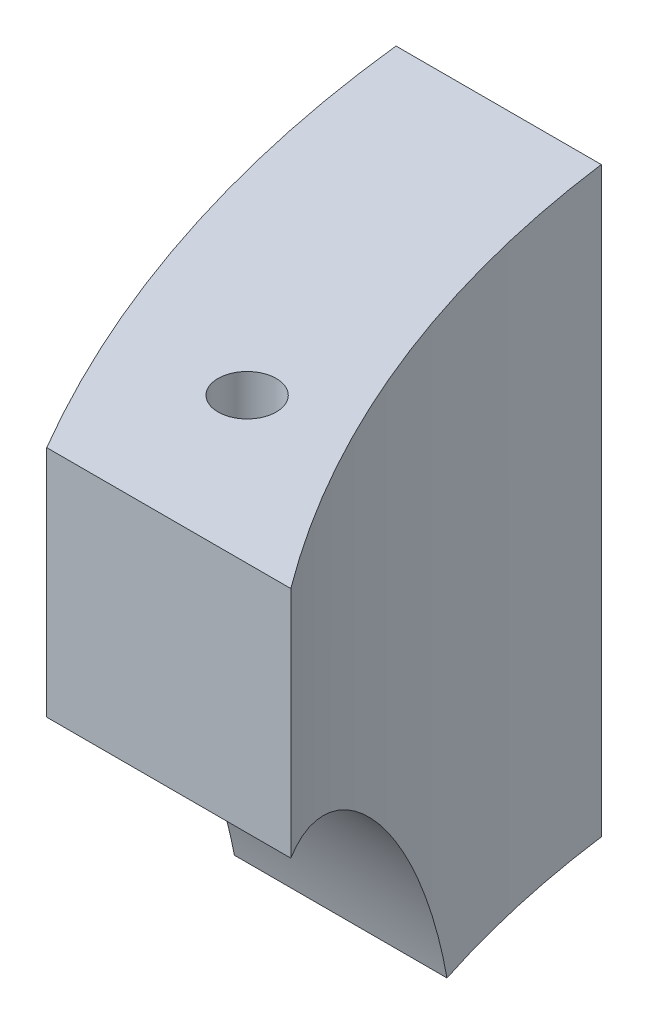
ISO-10303-21;
HEADER;
FILE_DESCRIPTION(('STEP AP214'),'2;1');
FILE_NAME('part.step','',(''),(''),'','','');
FILE_SCHEMA(('AUTOMOTIVE_DESIGN { 1 0 10303 214 1 1 1 1 }'));
ENDSEC;
DATA;
#1=APPLICATION_CONTEXT('core data for automotive mechanical design processes');
#2=APPLICATION_PROTOCOL_DEFINITION('international standard','automotive_design',2000,#1);
#3=PRODUCT_CONTEXT('',#1,'mechanical');
#4=PRODUCT('Part','Part','',(#3));
#5=PRODUCT_RELATED_PRODUCT_CATEGORY('part','',(#4));
#6=PRODUCT_DEFINITION_FORMATION('','',#4);
#7=PRODUCT_DEFINITION_CONTEXT('part definition',#1,'design');
#8=PRODUCT_DEFINITION('design','',#6,#7);
#9=PRODUCT_DEFINITION_SHAPE('','',#8);
#10=(LENGTH_UNIT() NAMED_UNIT(*) SI_UNIT(.MILLI.,.METRE.));
#11=(NAMED_UNIT(*) PLANE_ANGLE_UNIT() SI_UNIT($,.RADIAN.));
#12=(NAMED_UNIT(*) SI_UNIT($,.STERADIAN.) SOLID_ANGLE_UNIT());
#13=UNCERTAINTY_MEASURE_WITH_UNIT(LENGTH_MEASURE(1.E-05),#10,'distance_accuracy_value','');
#14=(GEOMETRIC_REPRESENTATION_CONTEXT(3) GLOBAL_UNCERTAINTY_ASSIGNED_CONTEXT((#13)) GLOBAL_UNIT_ASSIGNED_CONTEXT((#10,
#11,#12)) REPRESENTATION_CONTEXT('',''));
#15=CARTESIAN_POINT('',(0.,0.,0.));
#16=DIRECTION('',(0.,0.,1.));
#17=DIRECTION('',(1.,0.,0.));
#18=AXIS2_PLACEMENT_3D('',#15,#16,#17);
#19=CARTESIAN_POINT('',(0.,-60.,0.));
#20=DIRECTION('',(0.,1.,0.));
#21=DIRECTION('',(0.,0.,1.));
#22=AXIS2_PLACEMENT_3D('',#19,#20,#21);
#23=CYLINDRICAL_SURFACE('',#22,76.805);
#24=DIRECTION('',(0.,1.,0.));
#25=VECTOR('',#24,1.);
#26=CARTESIAN_POINT('',(-76.1512181452142,-100.,9.99999999999961));
#27=LINE('',#26,#25);
#28=CARTESIAN_POINT('',(-76.1512181452142,-100.,9.99999999999961));
#29=VERTEX_POINT('',#28);
#30=CARTESIAN_POINT('',(-76.1512181452142,-60.,9.99999999999961));
#31=VERTEX_POINT('',#30);
#32=EDGE_CURVE('E107',#29,#31,#27,.T.);
#33=ORIENTED_EDGE('',*,*,#32,.T.);
#34=CARTESIAN_POINT('',(0.,-60.,0.));
#35=DIRECTION('',(0.,-1.,0.));
#36=DIRECTION('',(0.,0.,-1.));
#37=AXIS2_PLACEMENT_3D('',#34,#35,#36);
#38=CIRCLE('',#37,76.805);
#39=CARTESIAN_POINT('',(-61.5905805028132,-60.,45.8869090081963));
#40=VERTEX_POINT('',#39);
#41=EDGE_CURVE('E88',#31,#40,#38,.F.);
#42=ORIENTED_EDGE('',*,*,#41,.T.);
#43=DIRECTION('',(0.,1.,0.));
#44=VECTOR('',#43,1.);
#45=CARTESIAN_POINT('',(-61.5905805028132,-100.,45.8869090081963));
#46=LINE('',#45,#44);
#47=CARTESIAN_POINT('',(-61.5905805028132,-76.0376066251599,45.8869090081963));
#48=VERTEX_POINT('',#47);
#49=EDGE_CURVE('E106',#48,#40,#46,.T.);
#50=ORIENTED_EDGE('',*,*,#49,.F.);
#51=CARTESIAN_POINT('',(-61.5905805028132,-76.0376066251599,45.8869090081963));
#52=CARTESIAN_POINT('',(-61.8724879759073,-76.1615804574404,45.508541010111));
#53=CARTESIAN_POINT('',(-62.1496833209392,-76.2933266038598,45.1291894544505));
#54=CARTESIAN_POINT('',(-62.6943847469691,-76.5728008223829,44.3693623114229));
#55=CARTESIAN_POINT('',(-62.9618898947462,-76.7205304283509,43.9888866195914));
#56=CARTESIAN_POINT('',(-63.4870614976273,-77.0324861006369,43.2274810640035));
#57=CARTESIAN_POINT('',(-63.7447214748006,-77.1967227788302,42.8465510656696));
#58=CARTESIAN_POINT('',(-64.2497301445695,-77.5419306381188,42.0854950338412));
#59=CARTESIAN_POINT('',(-64.4970791274666,-77.7229013476125,41.7053689779986));
#60=CARTESIAN_POINT('',(-65.2241351289306,-78.2920296701556,40.5663838739214));
#61=CARTESIAN_POINT('',(-65.6880671570044,-78.705940658175,39.8100582990234));
#62=CARTESIAN_POINT('',(-66.5720205057861,-79.6033606792859,38.3135700821961));
#63=CARTESIAN_POINT('',(-66.9920523591591,-80.0868529517458,37.5734035971985));
#64=CARTESIAN_POINT('',(-67.789457330275,-81.1257387039277,36.1149724125224));
#65=CARTESIAN_POINT('',(-68.1666320639874,-81.6814429119866,35.3968199772308));
#66=CARTESIAN_POINT('',(-68.8762432177263,-82.8614384512383,33.9954161489857));
#67=CARTESIAN_POINT('',(-69.2086751187448,-83.4857366988525,33.3121682856973));
#68=CARTESIAN_POINT('',(-69.829301277256,-84.7989121619739,31.9907659512638));
#69=CARTESIAN_POINT('',(-70.1175475464876,-85.4877118881778,31.3525589469111));
#70=CARTESIAN_POINT('',(-70.6518906952164,-86.9259293828332,30.1291241565394));
#71=CARTESIAN_POINT('',(-70.8979927127415,-87.6753397454977,29.5438899164388));
#72=CARTESIAN_POINT('',(-71.33366024115,-89.1719885659438,28.4749941344923));
#73=CARTESIAN_POINT('',(-71.5260516137345,-89.915338511502,27.9870286320866));
#74=CARTESIAN_POINT('',(-71.8786494685781,-91.4441654789608,27.0686141988077));
#75=CARTESIAN_POINT('',(-72.0388524348975,-92.2296470910442,26.6381715528745));
#76=CARTESIAN_POINT('',(-72.3289722770888,-93.8358756386956,25.8400457182096));
#77=CARTESIAN_POINT('',(-72.4589280853882,-94.6565756126157,25.4722820178698));
#78=CARTESIAN_POINT('',(-72.6908265875386,-96.3278865694105,24.8027696314158));
#79=CARTESIAN_POINT('',(-72.7927857121498,-97.1784796764486,24.5009822462556));
#80=CARTESIAN_POINT('',(-72.9150335177527,-98.3644406386399,24.1333160888137));
#81=CARTESIAN_POINT('',(-72.9465528429963,-98.6897337640126,24.0378356742379));
#82=CARTESIAN_POINT('',(-73.0059576790096,-99.3428916675791,23.8568067477289));
#83=CARTESIAN_POINT('',(-73.0338483671424,-99.6707520581313,23.77124410451));
#84=CARTESIAN_POINT('',(-73.0599944407869,-100.,23.690614962727));
#85=B_SPLINE_CURVE_WITH_KNOTS('',3,(#51,#52,#53,#54,#55,#56,#57,#58,#59,#60,#61,#62,#63,#64,#65,
#66,#67,#68,#69,#70,#71,#72,#73,#74,#75,#76,#77,#78,#79,#80,#81,#82,#83,#84),.UNSPECIFIED.,.F.,
.F.,(4,2,2,2,2,2,2,2,2,2,2,2,2,2,2,2,4),(0.,1.46350327731127,2.92714712556941,4.39173799686065,
5.85628760534677,8.78975158938339,11.7225101442121,14.668334326783,17.614455813495,
20.5570822853487,23.4993497503075,26.2253702261823,28.9516883036157,31.6744775693344,
34.3956654459655,35.4169674751842,36.4367959385946),.UNSPECIFIED.);
#86=CARTESIAN_POINT('',(-73.0599944407868,-100.,23.690614962727));
#87=VERTEX_POINT('',#86);
#88=EDGE_CURVE('E124',#48,#87,#85,.T.);
#89=ORIENTED_EDGE('',*,*,#88,.T.);
#90=CARTESIAN_POINT('',(2.08166817117217E-12,-100.,-8.46545056276682E-13));
#91=DIRECTION('',(0.,1.,0.));
#92=DIRECTION('',(0.,0.,1.));
#93=AXIS2_PLACEMENT_3D('',#90,#91,#92);
#94=CIRCLE('',#93,76.8050000000022);
#95=EDGE_CURVE('E93',#29,#87,#94,.T.);
#96=ORIENTED_EDGE('',*,*,#95,.F.);
#97=EDGE_LOOP('',(#33,#42,#50,#89,#96));
#98=FACE_BOUND('',#97,.T.);
#99=ADVANCED_FACE('F34',(#98),#23,.F.);
#100=CARTESIAN_POINT('',(0.,-60.,0.));
#101=DIRECTION('',(0.,1.,0.));
#102=DIRECTION('',(0.,0.,1.));
#103=AXIS2_PLACEMENT_3D('',#100,#101,#102);
#104=CYLINDRICAL_SURFACE('',#103,90.805);
#105=CARTESIAN_POINT('',(0.,-60.,0.));
#106=DIRECTION('',(0.,-1.,0.));
#107=DIRECTION('',(0.,0.,-1.));
#108=AXIS2_PLACEMENT_3D('',#105,#106,#107);
#109=CIRCLE('',#108,90.805);
#110=CARTESIAN_POINT('',(-90.252689849112,-60.,9.99999999999961));
#111=VERTEX_POINT('',#110);
#112=CARTESIAN_POINT('',(-78.3577667284712,-60.,45.8869090081963));
#113=VERTEX_POINT('',#112);
#114=EDGE_CURVE('E54',#111,#113,#109,.F.);
#115=ORIENTED_EDGE('',*,*,#114,.F.);
#116=DIRECTION('',(0.,1.,0.));
#117=VECTOR('',#116,1.);
#118=CARTESIAN_POINT('',(-90.252689849112,-100.,9.99999999999961));
#119=LINE('',#118,#117);
#120=CARTESIAN_POINT('',(-90.252689849112,-100.,9.99999999999961));
#121=VERTEX_POINT('',#120);
#122=EDGE_CURVE('E101',#121,#111,#119,.T.);
#123=ORIENTED_EDGE('',*,*,#122,.F.);
#124=CARTESIAN_POINT('',(2.26207941267376E-12,-100.,-8.74300631892311E-13));
#125=DIRECTION('',(0.,-1.,0.));
#126=DIRECTION('',(0.,0.,1.));
#127=AXIS2_PLACEMENT_3D('',#124,#125,#126);
#128=CIRCLE('',#127,90.8050000000023);
#129=CARTESIAN_POINT('',(-87.6601550745138,-100.,23.690614962727));
#130=VERTEX_POINT('',#129);
#131=EDGE_CURVE('E116',#130,#121,#128,.T.);
#132=ORIENTED_EDGE('',*,*,#131,.F.);
#133=CARTESIAN_POINT('',(-78.3577667284712,-76.0376066251599,45.8869090081963));
#134=CARTESIAN_POINT('',(-78.5924473159575,-76.1689068918217,45.4861771932687));
#135=CARTESIAN_POINT('',(-78.8228617009509,-76.3084983273187,45.0856503262618));
#136=CARTESIAN_POINT('',(-79.2749753014099,-76.6045032034185,44.2858553963328));
#137=CARTESIAN_POINT('',(-79.4966738682963,-76.7609178926845,43.8865874291163));
#138=CARTESIAN_POINT('',(-79.93123879399,-77.0908659244213,43.090034511724));
#139=CARTESIAN_POINT('',(-80.1441010131283,-77.2644071646159,42.6927505660127));
#140=CARTESIAN_POINT('',(-80.5606987495879,-77.628669644403,41.9013357120492));
#141=CARTESIAN_POINT('',(-80.7644344711998,-77.8193904991533,41.5072047333823));
#142=CARTESIAN_POINT('',(-81.3620238071811,-78.417776377688,40.3304179202884));
#143=CARTESIAN_POINT('',(-81.7420516661545,-78.8515073193961,39.5537506263202));
#144=CARTESIAN_POINT('',(-82.4642522133015,-79.7879903483694,38.0251245028361));
#145=CARTESIAN_POINT('',(-82.8064317795716,-80.2907298575056,37.2731612014305));
#146=CARTESIAN_POINT('',(-83.4541133476261,-81.3657172459826,35.7995644949122));
#147=CARTESIAN_POINT('',(-83.7594916971807,-81.9381871401374,35.0780383614937));
#148=CARTESIAN_POINT('',(-84.3328822717363,-83.1487224762524,33.6762045151858));
#149=CARTESIAN_POINT('',(-84.6008914114346,-83.7867933268575,32.9959002083003));
#150=CARTESIAN_POINT('',(-85.100587098163,-85.1243076507707,31.6848565251361));
#151=CARTESIAN_POINT('',(-85.332294366709,-85.8237157538185,31.0540889760324));
#152=CARTESIAN_POINT('',(-85.7612529753876,-87.2793457600486,29.849032109615));
#153=CARTESIAN_POINT('',(-85.9585077567818,-88.0355619781904,29.2747371540841));
#154=CARTESIAN_POINT('',(-86.3112785847532,-89.5587862752785,28.2171202605891));
#155=CARTESIAN_POINT('',(-86.4684233816406,-90.3232230496112,27.7306328623269));
#156=CARTESIAN_POINT('',(-86.7555037061851,-91.8928780923187,26.8190067726851));
#157=CARTESIAN_POINT('',(-86.8854355435854,-92.6981018733181,26.3938764041501));
#158=CARTESIAN_POINT('',(-87.1197567652052,-94.3419724243445,25.609826826792));
#159=CARTESIAN_POINT('',(-87.2241889062247,-95.1805604656519,25.2507970355623));
#160=CARTESIAN_POINT('',(-87.409530876033,-96.886051907719,24.601545085342));
#161=CARTESIAN_POINT('',(-87.4904556042024,-97.7529369840286,24.3112793641834));
#162=CARTESIAN_POINT('',(-87.5784852800884,-98.8576137884529,23.9908628374244));
#163=CARTESIAN_POINT('',(-87.5958350107837,-99.0852687247497,23.9274253555937));
#164=CARTESIAN_POINT('',(-87.6290759757658,-99.5417308559339,23.8054005587297));
#165=CARTESIAN_POINT('',(-87.6449686783639,-99.7705366401469,23.7468083668533));
#166=CARTESIAN_POINT('',(-87.6601550745138,-100.,23.690614962727));
#167=B_SPLINE_CURVE_WITH_KNOTS('',3,(#133,#134,#135,#136,#137,#138,#139,#140,#141,#142,#143,
#144,#145,#146,#147,#148,#149,#150,#151,#152,#153,#154,#155,#156,#157,#158,#159,#160,#161,#162,
#163,#164,#165,#166),.UNSPECIFIED.,.F.,.F.,(4,2,2,2,2,2,2,2,2,2,2,2,2,2,2,2,4),(0.,
1.447717955692,2.89554343881256,4.34403971873127,5.79250355880858,8.69081564008807,
11.5886001483948,14.4958647087084,17.4033691586731,20.3092078777708,23.2147561830751,
25.9703463563231,28.7263099641602,31.4776202583256,34.2271829032457,34.9380419918491,
35.6481766556987),.UNSPECIFIED.);
#168=CARTESIAN_POINT('',(-78.3577667284712,-76.0376066251599,45.8869090081963));
#169=VERTEX_POINT('',#168);
#170=EDGE_CURVE('E62',#169,#130,#167,.T.);
#171=ORIENTED_EDGE('',*,*,#170,.F.);
#172=DIRECTION('',(0.,1.,0.));
#173=VECTOR('',#172,1.);
#174=CARTESIAN_POINT('',(-78.3577667284712,-60.,45.8869090081963));
#175=LINE('',#174,#173);
#176=EDGE_CURVE('E94',#169,#113,#175,.T.);
#177=ORIENTED_EDGE('',*,*,#176,.T.);
#178=EDGE_LOOP('',(#115,#123,#132,#171,#177));
#179=FACE_BOUND('',#178,.T.);
#180=ADVANCED_FACE('F99',(#179),#104,.T.);
#181=CARTESIAN_POINT('',(-90.252689849112,-100.,9.99999999999961));
#182=DIRECTION('',(0.,0.,1.));
#183=DIRECTION('',(1.,0.,0.));
#184=AXIS2_PLACEMENT_3D('',#181,#182,#183);
#185=PLANE('',#184);
#186=CARTESIAN_POINT('',(-82.252689849112,-87.5,9.99999999999961));
#187=DIRECTION('',(0.,0.,-1.));
#188=DIRECTION('',(-1.,0.,0.));
#189=AXIS2_PLACEMENT_3D('',#186,#187,#188);
#190=CIRCLE('',#189,2.);
#191=CARTESIAN_POINT('',(-84.252689849112,-87.5,9.99999999999961));
#192=VERTEX_POINT('',#191);
#193=EDGE_CURVE('E156',#192,#192,#190,.T.);
#194=ORIENTED_EDGE('',*,*,#193,.F.);
#195=EDGE_LOOP('',(#194));
#196=FACE_BOUND('',#195,.T.);
#197=DIRECTION('',(1.,0.,0.));
#198=VECTOR('',#197,1.);
#199=CARTESIAN_POINT('',(-90.252689849112,-60.,9.99999999999961));
#200=LINE('',#199,#198);
#201=EDGE_CURVE('E85',#111,#31,#200,.T.);
#202=ORIENTED_EDGE('',*,*,#201,.T.);
#203=ORIENTED_EDGE('',*,*,#32,.F.);
#204=DIRECTION('',(1.,0.,0.));
#205=VECTOR('',#204,1.);
#206=CARTESIAN_POINT('',(-90.252689849112,-100.,9.99999999999961));
#207=LINE('',#206,#205);
#208=EDGE_CURVE('E105',#121,#29,#207,.T.);
#209=ORIENTED_EDGE('',*,*,#208,.F.);
#210=ORIENTED_EDGE('',*,*,#122,.T.);
#211=EDGE_LOOP('',(#202,#203,#209,#210));
#212=FACE_BOUND('',#211,.T.);
#213=ADVANCED_FACE('F104',(#196,#212),#185,.F.);
#214=CARTESIAN_POINT('',(2.08166817117217E-12,-100.,-8.46545056276682E-13));
#215=DIRECTION('',(0.,1.,0.));
#216=DIRECTION('',(0.,0.,1.));
#217=AXIS2_PLACEMENT_3D('',#214,#215,#216);
#218=PLANE('',#217);
#219=ORIENTED_EDGE('',*,*,#95,.T.);
#220=DIRECTION('',(1.,0.,0.));
#221=VECTOR('',#220,1.);
#222=CARTESIAN_POINT('',(-90.,-100.,23.690614962727));
#223=LINE('',#222,#221);
#224=EDGE_CURVE('E48',#87,#130,#223,.F.);
#225=ORIENTED_EDGE('',*,*,#224,.T.);
#226=ORIENTED_EDGE('',*,*,#131,.T.);
#227=ORIENTED_EDGE('',*,*,#208,.T.);
#228=EDGE_LOOP('',(#219,#225,#226,#227));
#229=FACE_BOUND('',#228,.T.);
#230=ADVANCED_FACE('F115',(#229),#218,.F.);
#231=CARTESIAN_POINT('',(-90.,-59.9171673050235,45.8869090081963));
#232=DIRECTION('',(0.,0.,1.));
#233=DIRECTION('',(1.,0.,0.));
#234=AXIS2_PLACEMENT_3D('',#231,#232,#233);
#235=PLANE('',#234);
#236=DIRECTION('',(1.,0.,0.));
#237=VECTOR('',#236,1.);
#238=CARTESIAN_POINT('',(-90.,-60.,45.8869090081963));
#239=LINE('',#238,#237);
#240=EDGE_CURVE('E11',#113,#40,#239,.T.);
#241=ORIENTED_EDGE('',*,*,#240,.F.);
#242=ORIENTED_EDGE('',*,*,#176,.F.);
#243=DIRECTION('',(1.,0.,0.));
#244=VECTOR('',#243,1.);
#245=CARTESIAN_POINT('',(-90.,-76.0376066251599,45.8869090081963));
#246=LINE('',#245,#244);
#247=EDGE_CURVE('E178',#169,#48,#246,.T.);
#248=ORIENTED_EDGE('',*,*,#247,.T.);
#249=ORIENTED_EDGE('',*,*,#49,.T.);
#250=EDGE_LOOP('',(#241,#242,#248,#249));
#251=FACE_BOUND('',#250,.T.);
#252=ADVANCED_FACE('F140',(#251),#235,.T.);
#253=CARTESIAN_POINT('',(-90.,-108.000167786146,56.3599898084857));
#254=DIRECTION('',(1.,0.,0.));
#255=DIRECTION('',(0.,0.,-1.));
#256=AXIS2_PLACEMENT_3D('',#253,#254,#255);
#257=CYLINDRICAL_SURFACE('',#256,33.6346657099366);
#258=CARTESIAN_POINT('',(-74.5905805028132,-79.8925883249909,37.8869090081963));
#259=CARTESIAN_POINT('',(-74.4919381024718,-79.8925876494779,37.886910057739));
#260=CARTESIAN_POINT('',(-74.3932984233326,-79.8974045752662,37.879574641305));
#261=CARTESIAN_POINT('',(-74.1990643123797,-79.9164334856359,37.8506706268829));
#262=CARTESIAN_POINT('',(-74.1034704252606,-79.930647140907,37.8290994978602));
#263=CARTESIAN_POINT('',(-73.9183169843913,-79.9677541619103,37.7730148653726));
#264=CARTESIAN_POINT('',(-73.8287395681785,-79.9906203635771,37.7385418700833));
#265=CARTESIAN_POINT('',(-73.6573104322726,-80.0441061588174,37.6583409654646));
#266=CARTESIAN_POINT('',(-73.5754603390429,-80.0747273797113,37.6126106939545));
#267=CARTESIAN_POINT('',(-73.4165492869476,-80.1445648706848,37.5089890962435));
#268=CARTESIAN_POINT('',(-73.3400086320911,-80.1841647376021,37.4505624751808));
#269=CARTESIAN_POINT('',(-73.1979504447499,-80.2695935276639,37.3255019622106));
#270=CARTESIAN_POINT('',(-73.1324370895971,-80.3154247995406,37.258864976557));
#271=CARTESIAN_POINT('',(-73.0035769258074,-80.4196251763493,37.1086529035651));
#272=CARTESIAN_POINT('',(-72.9421152203748,-80.478838332308,37.0240493492363));
#273=CARTESIAN_POINT('',(-72.8343117729956,-80.602486649225,36.8492415357029));
#274=CARTESIAN_POINT('',(-72.7879797213449,-80.6669251240664,36.7590337309129));
#275=CARTESIAN_POINT('',(-72.702990028811,-80.8118138248766,36.5584223004819));
#276=CARTESIAN_POINT('',(-72.667271019297,-80.8930415454429,36.4473347857182));
#277=CARTESIAN_POINT('',(-72.6157147225592,-81.0590686656895,36.2232717395477));
#278=CARTESIAN_POINT('',(-72.5998875683319,-81.143869863001,36.1102952755695));
#279=CARTESIAN_POINT('',(-72.5863503159674,-81.3297869800719,35.8658730511086));
#280=CARTESIAN_POINT('',(-72.5921131612187,-81.4312593584554,35.7344986572806));
#281=CARTESIAN_POINT('',(-72.629006420131,-81.6344825876318,35.4753406629648));
#282=CARTESIAN_POINT('',(-72.6601712768923,-81.7362336294591,35.3475621817619));
#283=CARTESIAN_POINT('',(-72.7513345183699,-81.9455954865533,35.0884133392869));
#284=CARTESIAN_POINT('',(-72.8135114819808,-82.0529916577668,34.9576251855252));
#285=CARTESIAN_POINT('',(-72.9679482804267,-82.2604455647596,34.7085800418953));
#286=CARTESIAN_POINT('',(-73.0601473882327,-82.3605176190106,34.5902983891212));
#287=CARTESIAN_POINT('',(-73.2375207201768,-82.5142977081177,34.4107317376554));
#288=CARTESIAN_POINT('',(-73.3138093128713,-82.5719537052931,34.3440098775041));
#289=CARTESIAN_POINT('',(-73.4793333584941,-82.6791064709874,34.2208568239338));
#290=CARTESIAN_POINT('',(-73.5685473498411,-82.7286164797888,34.1644089153078));
#291=CARTESIAN_POINT('',(-73.7415655666576,-82.8083931913032,34.0739359968611));
#292=CARTESIAN_POINT('',(-73.8233435919134,-82.8405244949932,34.0376962038673));
#293=CARTESIAN_POINT('',(-73.9938110367875,-82.8955132759761,33.9758709400627));
#294=CARTESIAN_POINT('',(-74.0824965179711,-82.9183759924722,33.9502794499284));
#295=CARTESIAN_POINT('',(-74.2652750851301,-82.9532394268613,33.9113189459625));
#296=CARTESIAN_POINT('',(-74.3594001211861,-82.9651671352841,33.8980320801966));
#297=CARTESIAN_POINT('',(-74.5493247082443,-82.9767986812711,33.8850744027406));
#298=CARTESIAN_POINT('',(-74.645123426872,-82.9765084314266,33.8853970050711));
#299=CARTESIAN_POINT('',(-74.8243875967286,-82.9644652601745,33.8988146376371));
#300=CARTESIAN_POINT('',(-74.908051779659,-82.9539751114895,33.9105026170725));
#301=CARTESIAN_POINT('',(-75.0717030254832,-82.9241296844777,33.9438450340387));
#302=CARTESIAN_POINT('',(-75.151689604634,-82.9047732435502,33.9655007786035));
#303=CARTESIAN_POINT('',(-75.3092387834228,-82.8575173548866,34.0185672274577));
#304=CARTESIAN_POINT('',(-75.3865992071851,-82.8293257802179,34.0503121246196));
#305=CARTESIAN_POINT('',(-75.5345390379904,-82.7661682245691,34.1217730837662));
#306=CARTESIAN_POINT('',(-75.6051144916032,-82.7311983293958,34.1614937518995));
#307=CARTESIAN_POINT('',(-75.7713139660186,-82.6376638387801,34.2683337073505));
#308=CARTESIAN_POINT('',(-75.8625789733266,-82.5758594408291,34.3394219144166));
#309=CARTESIAN_POINT('',(-76.0287355482759,-82.4441207474417,34.4924463870867));
#310=CARTESIAN_POINT('',(-76.1035898326017,-82.3741684814872,34.5744066890499));
#311=CARTESIAN_POINT('',(-76.2550242273526,-82.2094669689479,34.7694645993317));
#312=CARTESIAN_POINT('',(-76.3266821376625,-82.1130991589375,34.8850174916617));
#313=CARTESIAN_POINT('',(-76.4445390738922,-81.915988856915,35.1248652257935));
#314=CARTESIAN_POINT('',(-76.4907291529477,-81.8152448409297,35.2491631224515));
#315=CARTESIAN_POINT('',(-76.5581808912712,-81.6113392973282,35.5045966007249));
#316=CARTESIAN_POINT('',(-76.5791853666646,-81.5081636195361,35.6357886795123));
#317=CARTESIAN_POINT('',(-76.5949335055378,-81.3029853320338,35.9007795159136));
#318=CARTESIAN_POINT('',(-76.5896628122574,-81.2009833941687,36.0345796587973));
#319=CARTESIAN_POINT('',(-76.5505570300321,-80.9941311461536,36.3101444590365));
#320=CARTESIAN_POINT('',(-76.5148510679938,-80.8895404428865,36.4518489418498));
#321=CARTESIAN_POINT('',(-76.4107613840051,-80.6883570953563,36.7287681535069));
#322=CARTESIAN_POINT('',(-76.3424406142955,-80.5917494620227,36.8639948346688));
#323=CARTESIAN_POINT('',(-76.1981368619552,-80.438498724321,37.0815779022657));
#324=CARTESIAN_POINT('',(-76.1308491749747,-80.3786544330268,37.1674785967541));
#325=CARTESIAN_POINT('',(-75.9800707799443,-80.266664194755,37.3296668918994));
#326=CARTESIAN_POINT('',(-75.8965871650664,-80.2145148952166,37.4059586768405));
#327=CARTESIAN_POINT('',(-75.713525477295,-80.1195383208822,37.5459397164887));
#328=CARTESIAN_POINT('',(-75.6138144203857,-80.0767955928977,37.6095142382264));
#329=CARTESIAN_POINT('',(-75.4011621714334,-80.0034678175643,37.719176567376));
#330=CARTESIAN_POINT('',(-75.2882394650818,-79.9728660399485,37.7652884343651));
#331=CARTESIAN_POINT('',(-75.0779530243244,-79.9306821522558,37.8290467288362));
#332=CARTESIAN_POINT('',(-74.9823006375623,-79.9164556748531,37.8506370341123));
#333=CARTESIAN_POINT('',(-74.7879569871625,-79.8974116236296,37.8795638243515));
#334=CARTESIAN_POINT('',(-74.6892673831595,-79.8925890008085,37.8869079581803));
#335=CARTESIAN_POINT('',(-74.5905805028132,-79.8925883249909,37.8869090081963));
#336=B_SPLINE_CURVE_WITH_KNOTS('',3,(#258,#259,#260,#261,#262,#263,#264,#265,#266,#267,#268,
#269,#270,#271,#272,#273,#274,#275,#276,#277,#278,#279,#280,#281,#282,#283,#284,#285,#286,#287,
#288,#289,#290,#291,#292,#293,#294,#295,#296,#297,#298,#299,#300,#301,#302,#303,#304,#305,#306,
#307,#308,#309,#310,#311,#312,#313,#314,#315,#316,#317,#318,#319,#320,#321,#322,#323,#324,#325,
#326,#327,#328,#329,#330,#331,#332,#333,#334,#335),.UNSPECIFIED.,.T.,.F.,(4,2,2,2,2,2,2,2,2,2,2,
2,2,2,2,2,2,2,2,2,2,2,2,2,2,2,2,2,2,2,2,2,2,2,2,2,2,2,4),(0.,0.295543061906685,0.5911386839711,
0.885813901594473,1.18055100544546,1.491696702054,1.80296000205405,2.16212636321424,
2.52152231541366,2.94643351315853,3.37156107487568,3.86779375804624,4.36470041465287,
4.90285223015785,5.43992219628566,5.78855188885838,6.13660920675713,6.42060915157769,
6.7044483367266,6.99016910735621,7.2757516117817,7.52996050452445,7.784202740186,
8.04794265360891,8.31183532184535,8.70314527102876,9.09533522572514,9.59271772338167,
10.0902748406567,10.5928706552126,11.0957411183647,11.6319558994202,12.1671398520389,
12.5390625338964,12.9108226946453,13.2857989209938,13.6602566191303,13.9560918277659,
14.2517681564707),.UNSPECIFIED.);
#337=CARTESIAN_POINT('',(-74.5905805028132,-79.8925883249909,37.8869090081963));
#338=VERTEX_POINT('',#337);
#339=EDGE_CURVE('E148',#338,#338,#336,.T.);
#340=ORIENTED_EDGE('',*,*,#339,.T.);
#341=EDGE_LOOP('',(#340));
#342=FACE_BOUND('',#341,.T.);
#343=CARTESIAN_POINT('',(-84.252689849112,-87.5,29.6947716740126));
#344=CARTESIAN_POINT('',(-84.2526898139419,-87.3657366993989,29.7979943257589));
#345=CARTESIAN_POINT('',(-84.2391906382142,-87.2322317331251,29.902258963769));
#346=CARTESIAN_POINT('',(-84.1858034156289,-86.9698814524098,30.1103060404756));
#347=CARTESIAN_POINT('',(-84.1458732546115,-86.8410439209981,30.2140874430102));
#348=CARTESIAN_POINT('',(-84.0364129522304,-86.5840187294865,30.4241374509771));
#349=CARTESIAN_POINT('',(-83.9652512297336,-86.4563334423769,30.530181944256));
#350=CARTESIAN_POINT('',(-83.7925332547612,-86.2151770167176,30.7332542129593));
#351=CARTESIAN_POINT('',(-83.6910613857247,-86.1016676406363,30.8303060536996));
#352=CARTESIAN_POINT('',(-83.5024005491916,-85.9355931858072,30.9739232926357));
#353=CARTESIAN_POINT('',(-83.4248110563545,-85.8764134573696,31.0255184971181));
#354=CARTESIAN_POINT('',(-83.2582030654451,-85.7683058658962,31.1203347611509));
#355=CARTESIAN_POINT('',(-83.1692029432598,-85.7193618454436,31.1635690105083));
#356=CARTESIAN_POINT('',(-82.9965030426614,-85.6414610882937,31.2326891546527));
#357=CARTESIAN_POINT('',(-82.9143740462023,-85.6105354492142,31.2602632847376));
#358=CARTESIAN_POINT('',(-82.7443381769199,-85.5593439121614,31.3060210984695));
#359=CARTESIAN_POINT('',(-82.6564345902202,-85.5390720096213,31.324210071592));
#360=CARTESIAN_POINT('',(-82.4766570110163,-85.5104877723027,31.3498835438692));
#361=CARTESIAN_POINT('',(-82.3847648063136,-85.5022379485779,31.357312090982));
#362=CARTESIAN_POINT('',(-82.2005195479698,-85.4985602249985,31.3606217320737));
#363=CARTESIAN_POINT('',(-82.1081665925148,-85.5031297008486,31.3565051894989));
#364=CARTESIAN_POINT('',(-81.9340531311219,-85.5237679141138,31.3379526146309));
#365=CARTESIAN_POINT('',(-81.8520663461521,-85.5388101569862,31.3244378814596));
#366=CARTESIAN_POINT('',(-81.6923241063656,-85.5783429916166,31.2890263387727));
#367=CARTESIAN_POINT('',(-81.6145693760339,-85.6028351953436,31.2671280992082));
#368=CARTESIAN_POINT('',(-81.4596541585108,-85.6619511137065,31.2144838414234));
#369=CARTESIAN_POINT('',(-81.382881498535,-85.6971430540538,31.1832438757818));
#370=CARTESIAN_POINT('',(-81.2366344330731,-85.7753198631112,31.1142059901259));
#371=CARTESIAN_POINT('',(-81.1671648219405,-85.8183098012589,31.0764038047382));
#372=CARTESIAN_POINT('',(-81.0025343275998,-85.9341901692665,30.9751149728292));
#373=CARTESIAN_POINT('',(-80.9122581104457,-86.0111733679571,30.9083383353738));
#374=CARTESIAN_POINT('',(-80.7492894846116,-86.1758888125648,30.7669547346274));
#375=CARTESIAN_POINT('',(-80.6766373008838,-86.2636449722637,30.6923304056375));
#376=CARTESIAN_POINT('',(-80.5325292927153,-86.4701320973456,30.5187301981661));
#377=CARTESIAN_POINT('',(-80.4659699734666,-86.5911023796771,30.4183501339272));
#378=CARTESIAN_POINT('',(-80.3594128982819,-86.8412167304864,30.2139445258412));
#379=CARTESIAN_POINT('',(-80.3194219081433,-86.9703628718358,30.1099180605091));
#380=CARTESIAN_POINT('',(-80.2657692753272,-87.2345755234915,29.9004065972461));
#381=CARTESIAN_POINT('',(-80.2523164988328,-87.3696805094264,29.7949165583794));
#382=CARTESIAN_POINT('',(-80.2530790108298,-87.6415662626881,29.585982179663));
#383=CARTESIAN_POINT('',(-80.2673098567475,-87.7783479293369,29.4825390231058));
#384=CARTESIAN_POINT('',(-80.3257681538474,-88.0546723959493,29.2768088961742));
#385=CARTESIAN_POINT('',(-80.3710932874921,-88.1941282408695,29.1747085444578));
#386=CARTESIAN_POINT('',(-80.4944559489849,-88.4646769398794,28.9796506071305));
#387=CARTESIAN_POINT('',(-80.5724175243176,-88.5957884023267,28.8866724083524));
#388=CARTESIAN_POINT('',(-80.7307860022993,-88.801836961286,28.7425095671227));
#389=CARTESIAN_POINT('',(-80.8021280328636,-88.881162654243,28.6875753110026));
#390=CARTESIAN_POINT('',(-80.9596432871215,-89.0296126882398,28.5855978043985));
#391=CARTESIAN_POINT('',(-81.0458084088259,-89.098742563961,28.5385502707894));
#392=CARTESIAN_POINT('',(-81.2325341497349,-89.2239530736815,28.4538921722702));
#393=CARTESIAN_POINT('',(-81.3332041752501,-89.2799251537418,28.4163599238891));
#394=CARTESIAN_POINT('',(-81.5458407698694,-89.3745290258144,28.353212251782));
#395=CARTESIAN_POINT('',(-81.6577968090326,-89.4131768014496,28.327585842779));
#396=CARTESIAN_POINT('',(-81.8731601161894,-89.4663536909686,28.2924044594271));
#397=CARTESIAN_POINT('',(-81.9756577249006,-89.4834490779455,28.2811371109917));
#398=CARTESIAN_POINT('',(-82.1826553208342,-89.5014655715835,28.2692638739261));
#399=CARTESIAN_POINT('',(-82.2871540438421,-89.5023965733022,28.2686514628564));
#400=CARTESIAN_POINT('',(-82.4852411433263,-89.488691668083,28.2776816141583));
#401=CARTESIAN_POINT('',(-82.5789718537537,-89.4754357458665,28.2864150802806));
#402=CARTESIAN_POINT('',(-82.7624956462007,-89.4362080502936,28.3123395674823));
#403=CARTESIAN_POINT('',(-82.8522888694062,-89.4102367332783,28.3295302850407));
#404=CARTESIAN_POINT('',(-83.0272179676619,-89.3463278067527,28.3720196058676));
#405=CARTESIAN_POINT('',(-83.1122511942108,-89.3081978521951,28.3974486475613));
#406=CARTESIAN_POINT('',(-83.2743590051005,-89.2218123188407,28.4553879960579));
#407=CARTESIAN_POINT('',(-83.3514310674214,-89.1735535459219,28.4879005367647));
#408=CARTESIAN_POINT('',(-83.5040026069064,-89.0633169747176,28.5626647090636));
#409=CARTESIAN_POINT('',(-83.5785262726915,-89.0004389247951,28.6055738730033));
#410=CARTESIAN_POINT('',(-83.7158556361444,-88.8668710833936,28.6974831389345));
#411=CARTESIAN_POINT('',(-83.7786553465081,-88.7961773296961,28.7464863319171));
#412=CARTESIAN_POINT('',(-83.901425226,-88.6372349466431,28.8576554859324));
#413=CARTESIAN_POINT('',(-83.9593294912486,-88.5479885172304,28.9206724010232));
#414=CARTESIAN_POINT('',(-84.0592485204213,-88.3644543258618,29.0517082576255));
#415=CARTESIAN_POINT('',(-84.1012540838181,-88.2701636807441,29.1197300683441));
#416=CARTESIAN_POINT('',(-84.175074363085,-88.0640726235672,29.2701120841499));
#417=CARTESIAN_POINT('',(-84.2043463255585,-87.9518005877235,29.3530736720108));
#418=CARTESIAN_POINT('',(-84.2431584608246,-87.7261741920587,29.5220346029291));
#419=CARTESIAN_POINT('',(-84.2526898786649,-87.6128193744023,29.608035276635));
#420=CARTESIAN_POINT('',(-84.252689849112,-87.5,29.6947716740126));
#421=B_SPLINE_CURVE_WITH_KNOTS('',3,(#343,#344,#345,#346,#347,#348,#349,#350,#351,#352,#353,
#354,#355,#356,#357,#358,#359,#360,#361,#362,#363,#364,#365,#366,#367,#368,#369,#370,#371,#372,
#373,#374,#375,#376,#377,#378,#379,#380,#381,#382,#383,#384,#385,#386,#387,#388,#389,#390,#391,
#392,#393,#394,#395,#396,#397,#398,#399,#400,#401,#402,#403,#404,#405,#406,#407,#408,#409,#410,
#411,#412,#413,#414,#415,#416,#417,#418,#419,#420),.UNSPECIFIED.,.T.,.F.,(4,2,2,2,2,2,2,2,2,2,2,
2,2,2,2,2,2,2,2,2,2,2,2,2,2,2,2,2,2,2,2,2,2,2,2,2,2,2,4),(0.,0.507615380033855,1.01604152897883,
1.55495953465973,2.09239095890412,2.42242611619155,2.75193630234116,3.0267729224346,
3.30145447491866,3.57755925137392,3.85360750932818,4.10583109011791,4.35809771409896,
4.62724263816353,4.8965631631382,5.30274785664922,5.70985107955677,6.21934299312635,
6.7289646024354,7.24258138103113,7.75648688136221,8.28953634022426,8.82135210668615,
9.17997319425954,9.53839888629464,9.89968529076554,10.2606376782878,10.5724749535939,
10.8841213304132,11.1679926451736,11.4518537728612,11.7404490160005,12.0291354047314,
12.3474931917269,12.6660131186792,13.0355726644558,13.4053457473385,13.8316980509834,
14.2582394018662),.UNSPECIFIED.);
#422=CARTESIAN_POINT('',(-84.252689849112,-87.5,29.6947716740126));
#423=VERTEX_POINT('',#422);
#424=EDGE_CURVE('E38',#423,#423,#421,.T.);
#425=ORIENTED_EDGE('',*,*,#424,.T.);
#426=EDGE_LOOP('',(#425));
#427=FACE_BOUND('',#426,.T.);
#428=ORIENTED_EDGE('',*,*,#247,.F.);
#429=ORIENTED_EDGE('',*,*,#170,.T.);
#430=ORIENTED_EDGE('',*,*,#224,.F.);
#431=ORIENTED_EDGE('',*,*,#88,.F.);
#432=EDGE_LOOP('',(#428,#429,#430,#431));
#433=FACE_BOUND('',#432,.T.);
#434=ADVANCED_FACE('F135',(#342,#427,#433),#257,.F.);
#435=CARTESIAN_POINT('',(-91.805,-60.,9.99999999999961));
#436=DIRECTION('',(0.,-1.,0.));
#437=DIRECTION('',(0.,0.,-1.));
#438=AXIS2_PLACEMENT_3D('',#435,#436,#437);
#439=PLANE('',#438);
#440=CARTESIAN_POINT('',(-74.5905805028132,-60.,35.8869090081963));
#441=DIRECTION('',(0.,1.,0.));
#442=DIRECTION('',(0.,0.,1.));
#443=AXIS2_PLACEMENT_3D('',#440,#441,#442);
#444=CIRCLE('',#443,2.);
#445=CARTESIAN_POINT('',(-74.5905805028132,-60.,37.8869090081963));
#446=VERTEX_POINT('',#445);
#447=EDGE_CURVE('E157',#446,#446,#444,.T.);
#448=ORIENTED_EDGE('',*,*,#447,.F.);
#449=EDGE_LOOP('',(#448));
#450=FACE_BOUND('',#449,.T.);
#451=ORIENTED_EDGE('',*,*,#201,.F.);
#452=ORIENTED_EDGE('',*,*,#114,.T.);
#453=ORIENTED_EDGE('',*,*,#240,.T.);
#454=ORIENTED_EDGE('',*,*,#41,.F.);
#455=EDGE_LOOP('',(#451,#452,#453,#454));
#456=FACE_BOUND('',#455,.T.);
#457=ADVANCED_FACE('F86',(#450,#456),#439,.F.);
#458=CARTESIAN_POINT('',(-82.252689849112,-87.5,97.9999999999996));
#459=DIRECTION('',(0.,0.,-1.));
#460=DIRECTION('',(-1.,0.,0.));
#461=AXIS2_PLACEMENT_3D('',#458,#459,#460);
#462=CYLINDRICAL_SURFACE('',#461,2.);
#463=ORIENTED_EDGE('',*,*,#193,.T.);
#464=EDGE_LOOP('',(#463));
#465=FACE_BOUND('',#464,.T.);
#466=ORIENTED_EDGE('',*,*,#424,.F.);
#467=EDGE_LOOP('',(#466));
#468=FACE_BOUND('',#467,.T.);
#469=ADVANCED_FACE('F161',(#465,#468),#462,.F.);
#470=CARTESIAN_POINT('',(-74.5905805028132,-148.,35.8869090081963));
#471=DIRECTION('',(0.,1.,0.));
#472=DIRECTION('',(0.,0.,1.));
#473=AXIS2_PLACEMENT_3D('',#470,#471,#472);
#474=CYLINDRICAL_SURFACE('',#473,2.);
#475=ORIENTED_EDGE('',*,*,#447,.T.);
#476=EDGE_LOOP('',(#475));
#477=FACE_BOUND('',#476,.T.);
#478=ORIENTED_EDGE('',*,*,#339,.F.);
#479=EDGE_LOOP('',(#478));
#480=FACE_BOUND('',#479,.T.);
#481=ADVANCED_FACE('F158',(#477,#480),#474,.F.);
#482=CLOSED_SHELL('',(#99,#180,#213,#230,#252,#434,#457,#469,#481));
#483=MANIFOLD_SOLID_BREP('B2',#482);
#484=ADVANCED_BREP_SHAPE_REPRESENTATION('',(#18,#483),#14);
#485=SHAPE_DEFINITION_REPRESENTATION(#9,#484);
ENDSEC;
END-ISO-10303-21;
